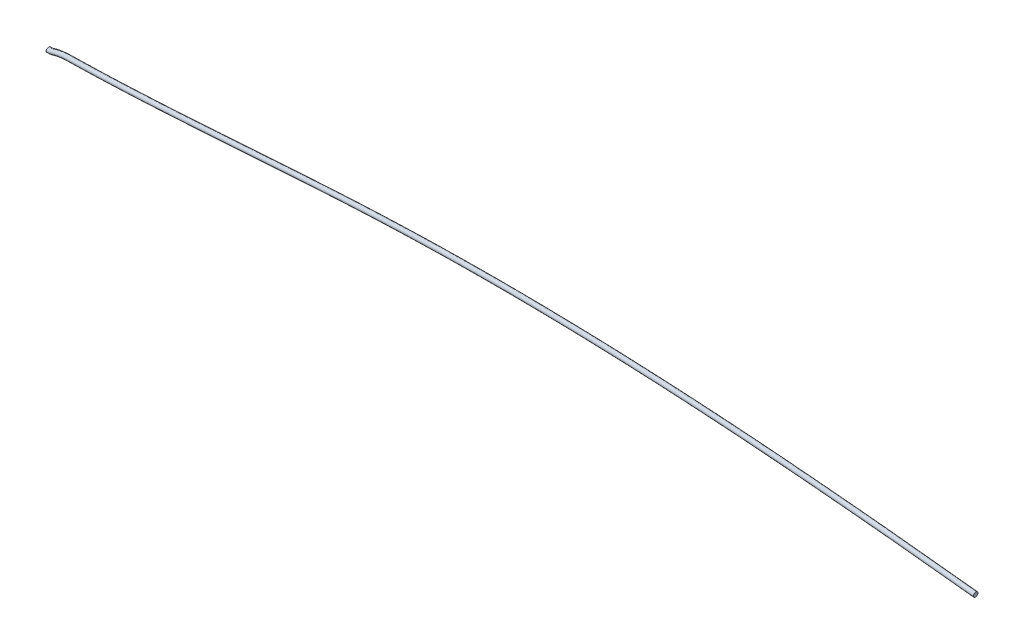
ISO-10303-21;
HEADER;
FILE_DESCRIPTION(('STEP AP214'),'2;1');
FILE_NAME('part.step','',(''),(''),'','','');
FILE_SCHEMA(('AUTOMOTIVE_DESIGN { 1 0 10303 214 1 1 1 1 }'));
ENDSEC;
DATA;
#1=APPLICATION_CONTEXT('core data for automotive mechanical design processes');
#2=APPLICATION_PROTOCOL_DEFINITION('international standard','automotive_design',2000,#1);
#3=PRODUCT_CONTEXT('',#1,'mechanical');
#4=PRODUCT('Part','Part','',(#3));
#5=PRODUCT_RELATED_PRODUCT_CATEGORY('part','',(#4));
#6=PRODUCT_DEFINITION_FORMATION('','',#4);
#7=PRODUCT_DEFINITION_CONTEXT('part definition',#1,'design');
#8=PRODUCT_DEFINITION('design','',#6,#7);
#9=PRODUCT_DEFINITION_SHAPE('','',#8);
#10=(LENGTH_UNIT() NAMED_UNIT(*) SI_UNIT(.MILLI.,.METRE.));
#11=(NAMED_UNIT(*) PLANE_ANGLE_UNIT() SI_UNIT($,.RADIAN.));
#12=(NAMED_UNIT(*) SI_UNIT($,.STERADIAN.) SOLID_ANGLE_UNIT());
#13=UNCERTAINTY_MEASURE_WITH_UNIT(LENGTH_MEASURE(1.E-05),#10,'distance_accuracy_value','');
#14=(GEOMETRIC_REPRESENTATION_CONTEXT(3) GLOBAL_UNCERTAINTY_ASSIGNED_CONTEXT((#13)) GLOBAL_UNIT_ASSIGNED_CONTEXT((#10,
#11,#12)) REPRESENTATION_CONTEXT('',''));
#15=CARTESIAN_POINT('',(0.,0.,0.));
#16=DIRECTION('',(0.,0.,1.));
#17=DIRECTION('',(1.,0.,0.));
#18=AXIS2_PLACEMENT_3D('',#15,#16,#17);
#19=CARTESIAN_POINT('',(34.9465312163158,3.23879951827669,0.));
#20=DIRECTION('',(-0.994086491317096,0.108591195687613,0.));
#21=DIRECTION('',(-0.108591195687613,-0.994086491317096,0.));
#22=AXIS2_PLACEMENT_3D('',#19,#20,#21);
#23=PLANE('',#22);
#24=CARTESIAN_POINT('',(34.9465312163158,3.23879951827669,0.));
#25=DIRECTION('',(-0.994086491317096,0.108591195687613,0.));
#26=DIRECTION('',(-0.108591195687613,-0.994086491317096,0.));
#27=AXIS2_PLACEMENT_3D('',#24,#25,#26);
#28=CIRCLE('',#27,0.25);
#29=CARTESIAN_POINT('',(34.9193834173939,2.99027789544741,0.));
#30=VERTEX_POINT('',#29);
#31=EDGE_CURVE('E49',#30,#30,#28,.T.);
#32=ORIENTED_EDGE('',*,*,#31,.F.);
#33=EDGE_LOOP('',(#32));
#34=FACE_BOUND('',#33,.T.);
#35=ADVANCED_FACE('F43',(#34),#23,.F.);
#36=CARTESIAN_POINT('',(-63.6908670313148,4.13547002842188,0.));
#37=DIRECTION('',(-0.984449044758904,0.175670368227776,0.));
#38=DIRECTION('',(-0.175670368227776,-0.984449044758904,0.));
#39=AXIS2_PLACEMENT_3D('',#36,#37,#38);
#40=PLANE('',#39);
#41=CARTESIAN_POINT('',(-63.6908670313148,4.13547002842188,0.));
#42=DIRECTION('',(-0.984449044758904,0.175670368227776,0.));
#43=DIRECTION('',(-0.175670368227776,-0.984449044758904,0.));
#44=AXIS2_PLACEMENT_3D('',#41,#42,#43);
#45=CIRCLE('',#44,0.25);
#46=CARTESIAN_POINT('',(-63.7347846233717,3.88935776723215,0.));
#47=VERTEX_POINT('',#46);
#48=EDGE_CURVE('E11',#47,#47,#45,.T.);
#49=ORIENTED_EDGE('',*,*,#48,.T.);
#50=EDGE_LOOP('',(#49));
#51=FACE_BOUND('',#50,.T.);
#52=ADVANCED_FACE('F58',(#51),#40,.T.);
#53=CARTESIAN_POINT('',(34.9193834173939,2.99027789544741,0.));
#54=CARTESIAN_POINT('',(23.8492083356911,4.19955250010807,0.));
#55=CARTESIAN_POINT('',(12.7726992397832,5.24398093783461,0.));
#56=CARTESIAN_POINT('',(-8.4957832761157,6.32189254869332,0.));
#57=CARTESIAN_POINT('',(-18.6831630154811,6.43420675601794,0.));
#58=CARTESIAN_POINT('',(-39.5416981330901,5.51566434786483,0.));
#59=CARTESIAN_POINT('',(-50.2235018399436,4.42373811415557,0.));
#60=CARTESIAN_POINT('',(-61.3899649155039,4.18637617798326,0.));
#61=CARTESIAN_POINT('',(-61.8426172793114,4.1777862327115,0.));
#62=CARTESIAN_POINT('',(-62.5039697029543,4.0881983919006,0.));
#63=CARTESIAN_POINT('',(-62.7131429406934,4.04623247607005,0.));
#64=CARTESIAN_POINT('',(-63.1645629994084,3.92184134758428,0.));
#65=CARTESIAN_POINT('',(-63.4308286000738,3.83511848062301,0.));
#66=CARTESIAN_POINT('',(-63.7347846233717,3.88935776723215,0.));
#67=CARTESIAN_POINT('',(34.9193834173939,2.99027789544741,0.5));
#68=CARTESIAN_POINT('',(23.8492083356911,4.19955250010807,0.5));
#69=CARTESIAN_POINT('',(12.7726992397832,5.24398093783461,0.5));
#70=CARTESIAN_POINT('',(-8.4957832761157,6.32189254869332,0.5));
#71=CARTESIAN_POINT('',(-18.6831630154811,6.43420675601794,0.5));
#72=CARTESIAN_POINT('',(-39.5416981330901,5.51566434786483,0.5));
#73=CARTESIAN_POINT('',(-50.2235018399436,4.42373811415557,0.5));
#74=CARTESIAN_POINT('',(-61.3899649155039,4.18637617798326,0.5));
#75=CARTESIAN_POINT('',(-61.8426172793114,4.1777862327115,0.5));
#76=CARTESIAN_POINT('',(-62.5039697029543,4.0881983919006,0.5));
#77=CARTESIAN_POINT('',(-62.7131429406934,4.04623247607005,0.5));
#78=CARTESIAN_POINT('',(-63.1645629994084,3.92184134758428,0.5));
#79=CARTESIAN_POINT('',(-63.4308286000738,3.83511848062301,0.5));
#80=CARTESIAN_POINT('',(-63.7347846233717,3.88935776723216,0.5));
#81=CARTESIAN_POINT('',(34.9736790152377,3.48732114110596,0.5));
#82=CARTESIAN_POINT('',(23.8986083378377,4.69713052679783,0.5));
#83=CARTESIAN_POINT('',(12.8124451439841,5.74260830231667,0.5));
#84=CARTESIAN_POINT('',(-8.4836789555805,6.82192082100814,0.5));
#85=CARTESIAN_POINT('',(-18.6868202029003,6.93453027966323,0.5));
#86=CARTESIAN_POINT('',(-39.5829881163738,6.01433064493748,0.5));
#87=CARTESIAN_POINT('',(-50.2609003072205,4.92305609519139,0.5));
#88=CARTESIAN_POINT('',(-61.399433126668,4.68628786412658,0.5));
#89=CARTESIAN_POINT('',(-61.871373016194,4.678457542552,0.5));
#90=CARTESIAN_POINT('',(-62.590268500199,4.58107482581257,0.5));
#91=CARTESIAN_POINT('',(-62.8400192689502,4.52990642925142,0.5));
#92=CARTESIAN_POINT('',(-63.3033409891025,4.40223574434187,0.5));
#93=CARTESIAN_POINT('',(-63.4932265229341,4.35415119932036,0.5));
#94=CARTESIAN_POINT('',(-63.6469494392578,4.38158228961161,0.5));
#95=CARTESIAN_POINT('',(34.9736790152377,3.48732114110596,0.));
#96=CARTESIAN_POINT('',(23.8986083378377,4.69713052679783,0.));
#97=CARTESIAN_POINT('',(12.8124451439841,5.74260830231667,0.));
#98=CARTESIAN_POINT('',(-8.4836789555805,6.82192082100814,0.));
#99=CARTESIAN_POINT('',(-18.6868202029003,6.93453027966323,0.));
#100=CARTESIAN_POINT('',(-39.5829881163738,6.01433064493748,0.));
#101=CARTESIAN_POINT('',(-50.2609003072205,4.92305609519139,0.));
#102=CARTESIAN_POINT('',(-61.399433126668,4.68628786412658,0.));
#103=CARTESIAN_POINT('',(-61.871373016194,4.678457542552,0.));
#104=CARTESIAN_POINT('',(-62.590268500199,4.58107482581257,0.));
#105=CARTESIAN_POINT('',(-62.8400192689502,4.52990642925142,0.));
#106=CARTESIAN_POINT('',(-63.3033409891025,4.40223574434187,0.));
#107=CARTESIAN_POINT('',(-63.4932265229341,4.35415119932036,0.));
#108=CARTESIAN_POINT('',(-63.6469494392578,4.38158228961161,0.));
#109=CARTESIAN_POINT('',(34.9736790152377,3.48732114110596,-0.5));
#110=CARTESIAN_POINT('',(23.8986083378377,4.69713052679783,-0.5));
#111=CARTESIAN_POINT('',(12.8124451439841,5.74260830231667,-0.5));
#112=CARTESIAN_POINT('',(-8.4836789555805,6.82192082100814,-0.5));
#113=CARTESIAN_POINT('',(-18.6868202029003,6.93453027966323,-0.5));
#114=CARTESIAN_POINT('',(-39.5829881163738,6.01433064493748,-0.5));
#115=CARTESIAN_POINT('',(-50.2609003072205,4.92305609519139,-0.5));
#116=CARTESIAN_POINT('',(-61.399433126668,4.68628786412658,-0.5));
#117=CARTESIAN_POINT('',(-61.871373016194,4.678457542552,-0.5));
#118=CARTESIAN_POINT('',(-62.590268500199,4.58107482581257,-0.5));
#119=CARTESIAN_POINT('',(-62.8400192689502,4.52990642925142,-0.5));
#120=CARTESIAN_POINT('',(-63.3033409891025,4.40223574434187,-0.5));
#121=CARTESIAN_POINT('',(-63.4932265229341,4.35415119932036,-0.5));
#122=CARTESIAN_POINT('',(-63.6469494392578,4.38158228961161,-0.5));
#123=CARTESIAN_POINT('',(34.9193834173939,2.99027789544741,-0.5));
#124=CARTESIAN_POINT('',(23.8492083356911,4.19955250010807,-0.5));
#125=CARTESIAN_POINT('',(12.7726992397832,5.24398093783461,-0.5));
#126=CARTESIAN_POINT('',(-8.4957832761157,6.32189254869332,-0.5));
#127=CARTESIAN_POINT('',(-18.6831630154811,6.43420675601794,-0.5));
#128=CARTESIAN_POINT('',(-39.5416981330901,5.51566434786483,-0.5));
#129=CARTESIAN_POINT('',(-50.2235018399436,4.42373811415557,-0.5));
#130=CARTESIAN_POINT('',(-61.3899649155039,4.18637617798326,-0.5));
#131=CARTESIAN_POINT('',(-61.8426172793114,4.1777862327115,-0.5));
#132=CARTESIAN_POINT('',(-62.5039697029543,4.0881983919006,-0.5));
#133=CARTESIAN_POINT('',(-62.7131429406934,4.04623247607005,-0.5));
#134=CARTESIAN_POINT('',(-63.1645629994084,3.92184134758428,-0.5));
#135=CARTESIAN_POINT('',(-63.4308286000738,3.83511848062301,-0.5));
#136=CARTESIAN_POINT('',(-63.7347846233717,3.88935776723216,-0.5));
#137=CARTESIAN_POINT('',(34.9193834173939,2.99027789544741,0.));
#138=CARTESIAN_POINT('',(23.8492083356911,4.19955250010807,0.));
#139=CARTESIAN_POINT('',(12.7726992397832,5.24398093783461,0.));
#140=CARTESIAN_POINT('',(-8.4957832761157,6.32189254869332,0.));
#141=CARTESIAN_POINT('',(-18.6831630154811,6.43420675601794,0.));
#142=CARTESIAN_POINT('',(-39.5416981330901,5.51566434786483,0.));
#143=CARTESIAN_POINT('',(-50.2235018399436,4.42373811415557,0.));
#144=CARTESIAN_POINT('',(-61.3899649155039,4.18637617798326,0.));
#145=CARTESIAN_POINT('',(-61.8426172793114,4.1777862327115,0.));
#146=CARTESIAN_POINT('',(-62.5039697029543,4.0881983919006,0.));
#147=CARTESIAN_POINT('',(-62.7131429406934,4.04623247607005,0.));
#148=CARTESIAN_POINT('',(-63.1645629994084,3.92184134758428,0.));
#149=CARTESIAN_POINT('',(-63.4308286000738,3.83511848062301,0.));
#150=CARTESIAN_POINT('',(-63.7347846233717,3.88935776723215,0.));
#151=(BOUNDED_SURFACE() B_SPLINE_SURFACE(3,3,((#53,#54,#55,#56,#57,#58,#59,#60,#61,#62,#63,#64,
#65,#66),(#67,#68,#69,#70,#71,#72,#73,#74,#75,#76,#77,#78,#79,#80),(#81,#82,#83,#84,#85,#86,#87,
#88,#89,#90,#91,#92,#93,#94),(#95,#96,#97,#98,#99,#100,#101,#102,#103,#104,#105,#106,#107,#108),
(#109,#110,#111,#112,#113,#114,#115,#116,#117,#118,#119,#120,#121,#122),(#123,#124,#125,#126,
#127,#128,#129,#130,#131,#132,#133,#134,#135,#136),(#137,#138,#139,#140,#141,#142,#143,#144,
#145,#146,#147,#148,#149,#150)),.UNSPECIFIED.,.T.,.F.,.F.) B_SPLINE_SURFACE_WITH_KNOTS((4,3,4),
(4,2,2,2,2,2,4),(0.,0.5,1.),(0.,0.337862326428497,0.646847124496668,0.971888501188436,
0.985944250594218,0.992972125297109,1.),
.UNSPECIFIED.) GEOMETRIC_REPRESENTATION_ITEM() RATIONAL_B_SPLINE_SURFACE(((1.,1.,1.,1.,1.,1.,1.,
1.,1.,1.,1.,1.,1.,1.),(0.333333333333333,0.333333333333333,0.333333333333333,0.333333333333333,
0.333333333333333,0.333333333333333,0.333333333333333,0.333333333333333,0.333333333333333,
0.333333333333333,0.333333333333333,0.333333333333333,0.333333333333333,0.333333333333333),
(0.333333333333333,0.333333333333333,0.333333333333333,0.333333333333333,0.333333333333333,
0.333333333333333,0.333333333333333,0.333333333333333,0.333333333333333,0.333333333333333,
0.333333333333333,0.333333333333333,0.333333333333333,0.333333333333333),(1.,1.,1.,1.,1.,1.,1.,
1.,1.,1.,1.,1.,1.,1.),(0.333333333333333,0.333333333333333,0.333333333333333,0.333333333333333,
0.333333333333333,0.333333333333333,0.333333333333333,0.333333333333333,0.333333333333333,
0.333333333333333,0.333333333333333,0.333333333333333,0.333333333333333,0.333333333333333),
(0.333333333333333,0.333333333333333,0.333333333333333,0.333333333333333,0.333333333333333,
0.333333333333333,0.333333333333333,0.333333333333333,0.333333333333333,0.333333333333333,
0.333333333333333,0.333333333333333,0.333333333333333,0.333333333333333),(1.,1.,1.,1.,1.,1.,1.,
1.,1.,1.,1.,1.,1.,1.))) REPRESENTATION_ITEM('') SURFACE());
#152=ORIENTED_EDGE('',*,*,#48,.F.);
#153=EDGE_LOOP('',(#152));
#154=FACE_BOUND('',#153,.T.);
#155=ORIENTED_EDGE('',*,*,#31,.T.);
#156=EDGE_LOOP('',(#155));
#157=FACE_BOUND('',#156,.T.);
#158=ADVANCED_FACE('F55',(#154,#157),#151,.T.);
#159=CLOSED_SHELL('',(#35,#52,#158));
#160=MANIFOLD_SOLID_BREP('B2',#159);
#161=ADVANCED_BREP_SHAPE_REPRESENTATION('',(#18,#160),#14);
#162=SHAPE_DEFINITION_REPRESENTATION(#9,#161);
ENDSEC;
END-ISO-10303-21;
